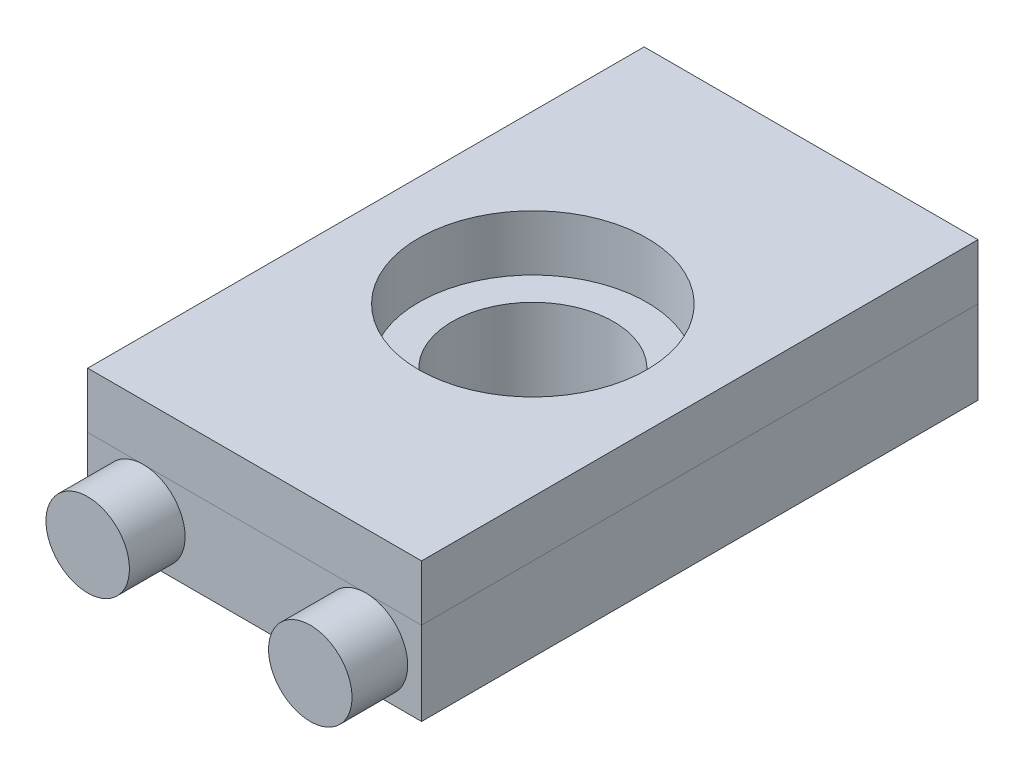
ISO-10303-21;
HEADER;
FILE_DESCRIPTION(('STEP AP214'),'2;1');
FILE_NAME('part.step','',(''),(''),'','','');
FILE_SCHEMA(('AUTOMOTIVE_DESIGN { 1 0 10303 214 1 1 1 1 }'));
ENDSEC;
DATA;
#1=APPLICATION_CONTEXT('core data for automotive mechanical design processes');
#2=APPLICATION_PROTOCOL_DEFINITION('international standard','automotive_design',2000,#1);
#3=PRODUCT_CONTEXT('',#1,'mechanical');
#4=PRODUCT('Part','Part','',(#3));
#5=PRODUCT_RELATED_PRODUCT_CATEGORY('part','',(#4));
#6=PRODUCT_DEFINITION_FORMATION('','',#4);
#7=PRODUCT_DEFINITION_CONTEXT('part definition',#1,'design');
#8=PRODUCT_DEFINITION('design','',#6,#7);
#9=PRODUCT_DEFINITION_SHAPE('','',#8);
#10=(LENGTH_UNIT() NAMED_UNIT(*) SI_UNIT(.MILLI.,.METRE.));
#11=(NAMED_UNIT(*) PLANE_ANGLE_UNIT() SI_UNIT($,.RADIAN.));
#12=(NAMED_UNIT(*) SI_UNIT($,.STERADIAN.) SOLID_ANGLE_UNIT());
#13=UNCERTAINTY_MEASURE_WITH_UNIT(LENGTH_MEASURE(1.E-05),#10,'distance_accuracy_value','');
#14=(GEOMETRIC_REPRESENTATION_CONTEXT(3) GLOBAL_UNCERTAINTY_ASSIGNED_CONTEXT((#13)) GLOBAL_UNIT_ASSIGNED_CONTEXT((#10,
#11,#12)) REPRESENTATION_CONTEXT('',''));
#15=CARTESIAN_POINT('',(0.,0.,0.));
#16=DIRECTION('',(0.,0.,1.));
#17=DIRECTION('',(1.,0.,0.));
#18=AXIS2_PLACEMENT_3D('',#15,#16,#17);
#19=CARTESIAN_POINT('',(12.,5.,0.));
#20=DIRECTION('',(-1.,0.,0.));
#21=DIRECTION('',(0.,0.,1.));
#22=AXIS2_PLACEMENT_3D('',#19,#20,#21);
#23=PLANE('',#22);
#24=DIRECTION('',(0.,0.,-1.));
#25=VECTOR('',#24,1.);
#26=CARTESIAN_POINT('',(12.,3.,0.));
#27=LINE('',#26,#25);
#28=CARTESIAN_POINT('',(12.,3.,0.));
#29=VERTEX_POINT('',#28);
#30=CARTESIAN_POINT('',(12.,3.,-20.));
#31=VERTEX_POINT('',#30);
#32=EDGE_CURVE('E139',#29,#31,#27,.T.);
#33=ORIENTED_EDGE('',*,*,#32,.T.);
#34=DIRECTION('',(0.,-1.,0.));
#35=VECTOR('',#34,1.);
#36=CARTESIAN_POINT('',(12.,5.,-20.));
#37=LINE('',#36,#35);
#38=CARTESIAN_POINT('',(12.,5.,-20.));
#39=VERTEX_POINT('',#38);
#40=EDGE_CURVE('E13',#39,#31,#37,.T.);
#41=ORIENTED_EDGE('',*,*,#40,.F.);
#42=DIRECTION('',(0.,0.,-1.));
#43=VECTOR('',#42,1.);
#44=CARTESIAN_POINT('',(12.,5.,0.));
#45=LINE('',#44,#43);
#46=CARTESIAN_POINT('',(12.,5.,0.));
#47=VERTEX_POINT('',#46);
#48=EDGE_CURVE('E124',#47,#39,#45,.T.);
#49=ORIENTED_EDGE('',*,*,#48,.F.);
#50=DIRECTION('',(0.,-1.,0.));
#51=VECTOR('',#50,1.);
#52=CARTESIAN_POINT('',(12.,5.,0.));
#53=LINE('',#52,#51);
#54=EDGE_CURVE('E132',#47,#29,#53,.T.);
#55=ORIENTED_EDGE('',*,*,#54,.T.);
#56=EDGE_LOOP('',(#33,#41,#49,#55));
#57=FACE_BOUND('',#56,.T.);
#58=ADVANCED_FACE('F72',(#57),#23,.F.);
#59=CARTESIAN_POINT('',(0.,5.,-20.));
#60=DIRECTION('',(0.,0.,1.));
#61=DIRECTION('',(1.,0.,0.));
#62=AXIS2_PLACEMENT_3D('',#59,#60,#61);
#63=PLANE('',#62);
#64=DIRECTION('',(-1.,0.,0.));
#65=VECTOR('',#64,1.);
#66=CARTESIAN_POINT('',(0.,3.,-20.));
#67=LINE('',#66,#65);
#68=CARTESIAN_POINT('',(0.,3.,-20.));
#69=VERTEX_POINT('',#68);
#70=EDGE_CURVE('E128',#31,#69,#67,.T.);
#71=ORIENTED_EDGE('',*,*,#70,.T.);
#72=DIRECTION('',(0.,-1.,0.));
#73=VECTOR('',#72,1.);
#74=CARTESIAN_POINT('',(0.,5.,-20.));
#75=LINE('',#74,#73);
#76=CARTESIAN_POINT('',(0.,5.,-20.));
#77=VERTEX_POINT('',#76);
#78=EDGE_CURVE('E81',#77,#69,#75,.T.);
#79=ORIENTED_EDGE('',*,*,#78,.F.);
#80=DIRECTION('',(-1.,0.,0.));
#81=VECTOR('',#80,1.);
#82=CARTESIAN_POINT('',(0.,5.,-20.));
#83=LINE('',#82,#81);
#84=EDGE_CURVE('E119',#39,#77,#83,.T.);
#85=ORIENTED_EDGE('',*,*,#84,.F.);
#86=ORIENTED_EDGE('',*,*,#40,.T.);
#87=EDGE_LOOP('',(#71,#79,#85,#86));
#88=FACE_BOUND('',#87,.T.);
#89=ADVANCED_FACE('F127',(#88),#63,.F.);
#90=CARTESIAN_POINT('',(0.,5.,0.));
#91=DIRECTION('',(1.,0.,0.));
#92=DIRECTION('',(0.,0.,-1.));
#93=AXIS2_PLACEMENT_3D('',#90,#91,#92);
#94=PLANE('',#93);
#95=DIRECTION('',(0.,0.,1.));
#96=VECTOR('',#95,1.);
#97=CARTESIAN_POINT('',(0.,3.,0.));
#98=LINE('',#97,#96);
#99=CARTESIAN_POINT('',(0.,3.,0.));
#100=VERTEX_POINT('',#99);
#101=EDGE_CURVE('E106',#69,#100,#98,.T.);
#102=ORIENTED_EDGE('',*,*,#101,.T.);
#103=DIRECTION('',(0.,-1.,0.));
#104=VECTOR('',#103,1.);
#105=CARTESIAN_POINT('',(0.,5.,0.));
#106=LINE('',#105,#104);
#107=CARTESIAN_POINT('',(0.,5.,0.));
#108=VERTEX_POINT('',#107);
#109=EDGE_CURVE('E129',#108,#100,#106,.T.);
#110=ORIENTED_EDGE('',*,*,#109,.F.);
#111=DIRECTION('',(0.,0.,1.));
#112=VECTOR('',#111,1.);
#113=CARTESIAN_POINT('',(0.,5.,0.));
#114=LINE('',#113,#112);
#115=EDGE_CURVE('E122',#77,#108,#114,.T.);
#116=ORIENTED_EDGE('',*,*,#115,.F.);
#117=ORIENTED_EDGE('',*,*,#78,.T.);
#118=EDGE_LOOP('',(#102,#110,#116,#117));
#119=FACE_BOUND('',#118,.T.);
#120=ADVANCED_FACE('F130',(#119),#94,.F.);
#121=CARTESIAN_POINT('',(6.,5.,-10.));
#122=DIRECTION('',(0.,-1.,0.));
#123=DIRECTION('',(0.,0.,-1.));
#124=AXIS2_PLACEMENT_3D('',#121,#122,#123);
#125=CYLINDRICAL_SURFACE('',#124,4.1);
#126=CARTESIAN_POINT('',(6.,5.,-10.));
#127=DIRECTION('',(0.,1.,0.));
#128=DIRECTION('',(0.,0.,1.));
#129=AXIS2_PLACEMENT_3D('',#126,#127,#128);
#130=CIRCLE('',#129,4.1);
#131=CARTESIAN_POINT('',(6.,5.,-5.9));
#132=VERTEX_POINT('',#131);
#133=EDGE_CURVE('E145',#132,#132,#130,.T.);
#134=ORIENTED_EDGE('',*,*,#133,.T.);
#135=EDGE_LOOP('',(#134));
#136=FACE_BOUND('',#135,.T.);
#137=CARTESIAN_POINT('',(6.,3.,-10.));
#138=DIRECTION('',(0.,1.,0.));
#139=DIRECTION('',(0.,0.,1.));
#140=AXIS2_PLACEMENT_3D('',#137,#138,#139);
#141=CIRCLE('',#140,4.1);
#142=CARTESIAN_POINT('',(6.,3.,-5.9));
#143=VERTEX_POINT('',#142);
#144=EDGE_CURVE('E136',#143,#143,#141,.T.);
#145=ORIENTED_EDGE('',*,*,#144,.F.);
#146=EDGE_LOOP('',(#145));
#147=FACE_BOUND('',#146,.T.);
#148=ADVANCED_FACE('F74',(#136,#147),#125,.F.);
#149=CARTESIAN_POINT('',(0.,5.,0.));
#150=DIRECTION('',(0.,0.,-1.));
#151=DIRECTION('',(-1.,0.,0.));
#152=AXIS2_PLACEMENT_3D('',#149,#150,#151);
#153=PLANE('',#152);
#154=DIRECTION('',(1.,0.,0.));
#155=VECTOR('',#154,1.);
#156=CARTESIAN_POINT('',(0.,3.,0.));
#157=LINE('',#156,#155);
#158=EDGE_CURVE('E112',#100,#29,#157,.T.);
#159=ORIENTED_EDGE('',*,*,#158,.T.);
#160=ORIENTED_EDGE('',*,*,#54,.F.);
#161=DIRECTION('',(1.,0.,0.));
#162=VECTOR('',#161,1.);
#163=CARTESIAN_POINT('',(0.,5.,0.));
#164=LINE('',#163,#162);
#165=EDGE_CURVE('E89',#108,#47,#164,.T.);
#166=ORIENTED_EDGE('',*,*,#165,.F.);
#167=ORIENTED_EDGE('',*,*,#109,.T.);
#168=EDGE_LOOP('',(#159,#160,#166,#167));
#169=FACE_BOUND('',#168,.T.);
#170=ADVANCED_FACE('F147',(#169),#153,.F.);
#171=CARTESIAN_POINT('',(0.,5.,0.));
#172=DIRECTION('',(0.,1.,0.));
#173=DIRECTION('',(0.,0.,1.));
#174=AXIS2_PLACEMENT_3D('',#171,#172,#173);
#175=PLANE('',#174);
#176=ORIENTED_EDGE('',*,*,#133,.F.);
#177=EDGE_LOOP('',(#176));
#178=FACE_BOUND('',#177,.T.);
#179=ORIENTED_EDGE('',*,*,#48,.T.);
#180=ORIENTED_EDGE('',*,*,#84,.T.);
#181=ORIENTED_EDGE('',*,*,#115,.T.);
#182=ORIENTED_EDGE('',*,*,#165,.T.);
#183=EDGE_LOOP('',(#179,#180,#181,#182));
#184=FACE_BOUND('',#183,.T.);
#185=ADVANCED_FACE('F120',(#178,#184),#175,.T.);
#186=CARTESIAN_POINT('',(0.,3.,0.));
#187=DIRECTION('',(0.,1.,0.));
#188=DIRECTION('',(0.,0.,1.));
#189=AXIS2_PLACEMENT_3D('',#186,#187,#188);
#190=PLANE('',#189);
#191=ORIENTED_EDGE('',*,*,#144,.T.);
#192=EDGE_LOOP('',(#191));
#193=FACE_BOUND('',#192,.T.);
#194=ORIENTED_EDGE('',*,*,#32,.F.);
#195=ORIENTED_EDGE('',*,*,#158,.F.);
#196=ORIENTED_EDGE('',*,*,#101,.F.);
#197=ORIENTED_EDGE('',*,*,#70,.F.);
#198=EDGE_LOOP('',(#194,#195,#196,#197));
#199=FACE_BOUND('',#198,.T.);
#200=ADVANCED_FACE('F150',(#193,#199),#190,.F.);
#201=CLOSED_SHELL('',(#58,#89,#120,#148,#170,#185,#200));
#202=MANIFOLD_SOLID_BREP('B2',#201);
#203=CARTESIAN_POINT('',(0.,3.,0.));
#204=DIRECTION('',(0.,0.,-1.));
#205=DIRECTION('',(-1.,0.,0.));
#206=AXIS2_PLACEMENT_3D('',#203,#204,#205);
#207=PLANE('',#206);
#208=CARTESIAN_POINT('',(2.,1.5,0.));
#209=DIRECTION('',(0.,0.,1.));
#210=DIRECTION('',(1.,0.,0.));
#211=AXIS2_PLACEMENT_3D('',#208,#209,#210);
#212=CIRCLE('',#211,1.5);
#213=CARTESIAN_POINT('',(2.,3.,0.));
#214=VERTEX_POINT('',#213);
#215=CARTESIAN_POINT('',(2.,0.,0.));
#216=VERTEX_POINT('',#215);
#217=EDGE_CURVE('E241',#214,#216,#212,.T.);
#218=ORIENTED_EDGE('',*,*,#217,.F.);
#219=DIRECTION('',(1.,0.,0.));
#220=VECTOR('',#219,1.);
#221=CARTESIAN_POINT('',(0.,3.,0.));
#222=LINE('',#221,#220);
#223=CARTESIAN_POINT('',(0.,3.,0.));
#224=VERTEX_POINT('',#223);
#225=EDGE_CURVE('E339',#224,#214,#222,.T.);
#226=ORIENTED_EDGE('',*,*,#225,.F.);
#227=DIRECTION('',(0.,-1.,0.));
#228=VECTOR('',#227,1.);
#229=CARTESIAN_POINT('',(0.,3.,0.));
#230=LINE('',#229,#228);
#231=CARTESIAN_POINT('',(0.,0.,0.));
#232=VERTEX_POINT('',#231);
#233=EDGE_CURVE('E314',#224,#232,#230,.T.);
#234=ORIENTED_EDGE('',*,*,#233,.T.);
#235=DIRECTION('',(1.,0.,0.));
#236=VECTOR('',#235,1.);
#237=CARTESIAN_POINT('',(0.,0.,0.));
#238=LINE('',#237,#236);
#239=EDGE_CURVE('E287',#232,#216,#238,.T.);
#240=ORIENTED_EDGE('',*,*,#239,.T.);
#241=EDGE_LOOP('',(#218,#226,#234,#240));
#242=FACE_BOUND('',#241,.T.);
#243=ADVANCED_FACE('F229',(#242),#207,.F.);
#244=CARTESIAN_POINT('',(10.,1.5,0.));
#245=DIRECTION('',(0.,0.,1.));
#246=DIRECTION('',(-1.,0.,0.));
#247=AXIS2_PLACEMENT_3D('',#244,#245,#246);
#248=CIRCLE('',#247,1.5);
#249=CARTESIAN_POINT('',(10.,0.,0.));
#250=VERTEX_POINT('',#249);
#251=CARTESIAN_POINT('',(10.,3.,0.));
#252=VERTEX_POINT('',#251);
#253=EDGE_CURVE('E302',#250,#252,#248,.T.);
#254=ORIENTED_EDGE('',*,*,#253,.F.);
#255=CARTESIAN_POINT('',(12.,0.,0.));
#256=VERTEX_POINT('',#255);
#257=EDGE_CURVE('E288',#250,#256,#238,.T.);
#258=ORIENTED_EDGE('',*,*,#257,.T.);
#259=DIRECTION('',(0.,-1.,0.));
#260=VECTOR('',#259,1.);
#261=CARTESIAN_POINT('',(12.,3.,0.));
#262=LINE('',#261,#260);
#263=CARTESIAN_POINT('',(12.,3.,0.));
#264=VERTEX_POINT('',#263);
#265=EDGE_CURVE('E356',#264,#256,#262,.T.);
#266=ORIENTED_EDGE('',*,*,#265,.F.);
#267=EDGE_CURVE('E304',#252,#264,#222,.T.);
#268=ORIENTED_EDGE('',*,*,#267,.F.);
#269=EDGE_LOOP('',(#254,#258,#266,#268));
#270=FACE_BOUND('',#269,.T.);
#271=ADVANCED_FACE('F303',(#270),#207,.F.);
#272=CARTESIAN_POINT('',(0.,3.,0.));
#273=DIRECTION('',(0.,1.,0.));
#274=DIRECTION('',(0.,0.,1.));
#275=AXIS2_PLACEMENT_3D('',#272,#273,#274);
#276=PLANE('',#275);
#277=DIRECTION('',(1.,0.,0.));
#278=VECTOR('',#277,1.);
#279=CARTESIAN_POINT('',(0.,3.,-20.));
#280=LINE('',#279,#278);
#281=CARTESIAN_POINT('',(0.,3.,-20.));
#282=VERTEX_POINT('',#281);
#283=CARTESIAN_POINT('',(12.,3.,-20.));
#284=VERTEX_POINT('',#283);
#285=EDGE_CURVE('E331',#282,#284,#280,.T.);
#286=ORIENTED_EDGE('',*,*,#285,.F.);
#287=DIRECTION('',(0.,0.,-1.));
#288=VECTOR('',#287,1.);
#289=CARTESIAN_POINT('',(0.,3.,0.));
#290=LINE('',#289,#288);
#291=EDGE_CURVE('E342',#224,#282,#290,.T.);
#292=ORIENTED_EDGE('',*,*,#291,.F.);
#293=ORIENTED_EDGE('',*,*,#225,.T.);
#294=EDGE_CURVE('E343',#214,#252,#222,.T.);
#295=ORIENTED_EDGE('',*,*,#294,.T.);
#296=ORIENTED_EDGE('',*,*,#267,.T.);
#297=DIRECTION('',(0.,0.,-1.));
#298=VECTOR('',#297,1.);
#299=CARTESIAN_POINT('',(12.,3.,0.));
#300=LINE('',#299,#298);
#301=EDGE_CURVE('E335',#264,#284,#300,.T.);
#302=ORIENTED_EDGE('',*,*,#301,.T.);
#303=EDGE_LOOP('',(#286,#292,#293,#295,#296,#302));
#304=FACE_BOUND('',#303,.T.);
#305=CARTESIAN_POINT('',(6.,3.,-10.));
#306=DIRECTION('',(0.,1.,0.));
#307=DIRECTION('',(0.,0.,1.));
#308=AXIS2_PLACEMENT_3D('',#305,#306,#307);
#309=CIRCLE('',#308,2.9);
#310=CARTESIAN_POINT('',(6.,3.,-7.1));
#311=VERTEX_POINT('',#310);
#312=EDGE_CURVE('E321',#311,#311,#309,.T.);
#313=ORIENTED_EDGE('',*,*,#312,.F.);
#314=EDGE_LOOP('',(#313));
#315=FACE_BOUND('',#314,.T.);
#316=ADVANCED_FACE('F372',(#304,#315),#276,.T.);
#317=CARTESIAN_POINT('',(0.,0.,0.));
#318=DIRECTION('',(0.,1.,0.));
#319=DIRECTION('',(0.,0.,1.));
#320=AXIS2_PLACEMENT_3D('',#317,#318,#319);
#321=PLANE('',#320);
#322=DIRECTION('',(1.,0.,0.));
#323=VECTOR('',#322,1.);
#324=CARTESIAN_POINT('',(0.,0.,-20.));
#325=LINE('',#324,#323);
#326=CARTESIAN_POINT('',(0.,0.,-20.));
#327=VERTEX_POINT('',#326);
#328=CARTESIAN_POINT('',(12.,0.,-20.));
#329=VERTEX_POINT('',#328);
#330=EDGE_CURVE('E325',#327,#329,#325,.T.);
#331=ORIENTED_EDGE('',*,*,#330,.T.);
#332=DIRECTION('',(0.,0.,-1.));
#333=VECTOR('',#332,1.);
#334=CARTESIAN_POINT('',(12.,0.,0.));
#335=LINE('',#334,#333);
#336=EDGE_CURVE('E296',#256,#329,#335,.T.);
#337=ORIENTED_EDGE('',*,*,#336,.F.);
#338=ORIENTED_EDGE('',*,*,#257,.F.);
#339=EDGE_CURVE('E280',#216,#250,#238,.T.);
#340=ORIENTED_EDGE('',*,*,#339,.F.);
#341=ORIENTED_EDGE('',*,*,#239,.F.);
#342=DIRECTION('',(0.,0.,-1.));
#343=VECTOR('',#342,1.);
#344=CARTESIAN_POINT('',(0.,0.,0.));
#345=LINE('',#344,#343);
#346=EDGE_CURVE('E336',#232,#327,#345,.T.);
#347=ORIENTED_EDGE('',*,*,#346,.T.);
#348=EDGE_LOOP('',(#331,#337,#338,#340,#341,#347));
#349=FACE_BOUND('',#348,.T.);
#350=CARTESIAN_POINT('',(6.,0.,-10.));
#351=DIRECTION('',(0.,1.,0.));
#352=DIRECTION('',(0.,0.,1.));
#353=AXIS2_PLACEMENT_3D('',#350,#351,#352);
#354=CIRCLE('',#353,2.9);
#355=CARTESIAN_POINT('',(6.,0.,-7.1));
#356=VERTEX_POINT('',#355);
#357=EDGE_CURVE('E326',#356,#356,#354,.T.);
#358=ORIENTED_EDGE('',*,*,#357,.T.);
#359=EDGE_LOOP('',(#358));
#360=FACE_BOUND('',#359,.T.);
#361=ADVANCED_FACE('F293',(#349,#360),#321,.F.);
#362=CARTESIAN_POINT('',(0.,3.,-20.));
#363=DIRECTION('',(0.,0.,-1.));
#364=DIRECTION('',(-1.,0.,0.));
#365=AXIS2_PLACEMENT_3D('',#362,#363,#364);
#366=PLANE('',#365);
#367=ORIENTED_EDGE('',*,*,#330,.F.);
#368=DIRECTION('',(0.,-1.,0.));
#369=VECTOR('',#368,1.);
#370=CARTESIAN_POINT('',(0.,3.,-20.));
#371=LINE('',#370,#369);
#372=EDGE_CURVE('E312',#282,#327,#371,.T.);
#373=ORIENTED_EDGE('',*,*,#372,.F.);
#374=ORIENTED_EDGE('',*,*,#285,.T.);
#375=DIRECTION('',(0.,-1.,0.));
#376=VECTOR('',#375,1.);
#377=CARTESIAN_POINT('',(12.,3.,-20.));
#378=LINE('',#377,#376);
#379=EDGE_CURVE('E233',#284,#329,#378,.T.);
#380=ORIENTED_EDGE('',*,*,#379,.T.);
#381=EDGE_LOOP('',(#367,#373,#374,#380));
#382=FACE_BOUND('',#381,.T.);
#383=ADVANCED_FACE('F231',(#382),#366,.T.);
#384=CARTESIAN_POINT('',(0.,3.,0.));
#385=DIRECTION('',(-1.,0.,0.));
#386=DIRECTION('',(0.,0.,1.));
#387=AXIS2_PLACEMENT_3D('',#384,#385,#386);
#388=PLANE('',#387);
#389=ORIENTED_EDGE('',*,*,#346,.F.);
#390=ORIENTED_EDGE('',*,*,#233,.F.);
#391=ORIENTED_EDGE('',*,*,#291,.T.);
#392=ORIENTED_EDGE('',*,*,#372,.T.);
#393=EDGE_LOOP('',(#389,#390,#391,#392));
#394=FACE_BOUND('',#393,.T.);
#395=ADVANCED_FACE('F368',(#394),#388,.T.);
#396=EDGE_CURVE('E70',#216,#214,#212,.T.);
#397=ORIENTED_EDGE('',*,*,#396,.F.);
#398=ORIENTED_EDGE('',*,*,#339,.T.);
#399=EDGE_CURVE('E239',#252,#250,#248,.T.);
#400=ORIENTED_EDGE('',*,*,#399,.F.);
#401=ORIENTED_EDGE('',*,*,#294,.F.);
#402=EDGE_LOOP('',(#397,#398,#400,#401));
#403=FACE_BOUND('',#402,.T.);
#404=ADVANCED_FACE('F282',(#403),#207,.F.);
#405=CARTESIAN_POINT('',(12.,3.,0.));
#406=DIRECTION('',(-1.,0.,0.));
#407=DIRECTION('',(0.,0.,1.));
#408=AXIS2_PLACEMENT_3D('',#405,#406,#407);
#409=PLANE('',#408);
#410=ORIENTED_EDGE('',*,*,#336,.T.);
#411=ORIENTED_EDGE('',*,*,#379,.F.);
#412=ORIENTED_EDGE('',*,*,#301,.F.);
#413=ORIENTED_EDGE('',*,*,#265,.T.);
#414=EDGE_LOOP('',(#410,#411,#412,#413));
#415=FACE_BOUND('',#414,.T.);
#416=ADVANCED_FACE('F365',(#415),#409,.F.);
#417=CARTESIAN_POINT('',(6.,3.,-10.));
#418=DIRECTION('',(0.,-1.,0.));
#419=DIRECTION('',(0.,0.,-1.));
#420=AXIS2_PLACEMENT_3D('',#417,#418,#419);
#421=CYLINDRICAL_SURFACE('',#420,2.9);
#422=ORIENTED_EDGE('',*,*,#312,.T.);
#423=EDGE_LOOP('',(#422));
#424=FACE_BOUND('',#423,.T.);
#425=ORIENTED_EDGE('',*,*,#357,.F.);
#426=EDGE_LOOP('',(#425));
#427=FACE_BOUND('',#426,.T.);
#428=ADVANCED_FACE('F397',(#424,#427),#421,.F.);
#429=CARTESIAN_POINT('',(10.,1.5,2.));
#430=DIRECTION('',(0.,0.,-1.));
#431=DIRECTION('',(-1.,0.,0.));
#432=AXIS2_PLACEMENT_3D('',#429,#430,#431);
#433=CYLINDRICAL_SURFACE('',#432,1.5);
#434=CARTESIAN_POINT('',(10.,1.5,2.));
#435=DIRECTION('',(0.,0.,1.));
#436=DIRECTION('',(-1.,0.,0.));
#437=AXIS2_PLACEMENT_3D('',#434,#435,#436);
#438=CIRCLE('',#437,1.5);
#439=CARTESIAN_POINT('',(8.5,1.5,2.));
#440=VERTEX_POINT('',#439);
#441=EDGE_CURVE('E308',#440,#440,#438,.T.);
#442=ORIENTED_EDGE('',*,*,#441,.F.);
#443=EDGE_LOOP('',(#442));
#444=FACE_BOUND('',#443,.T.);
#445=ORIENTED_EDGE('',*,*,#253,.T.);
#446=ORIENTED_EDGE('',*,*,#399,.T.);
#447=EDGE_LOOP('',(#445,#446));
#448=FACE_BOUND('',#447,.T.);
#449=ADVANCED_FACE('F310',(#444,#448),#433,.T.);
#450=CARTESIAN_POINT('',(10.,1.5,2.));
#451=DIRECTION('',(0.,0.,-1.));
#452=DIRECTION('',(-1.,0.,0.));
#453=AXIS2_PLACEMENT_3D('',#450,#451,#452);
#454=PLANE('',#453);
#455=ORIENTED_EDGE('',*,*,#441,.T.);
#456=EDGE_LOOP('',(#455));
#457=FACE_BOUND('',#456,.T.);
#458=ADVANCED_FACE('F408',(#457),#454,.F.);
#459=CARTESIAN_POINT('',(2.,1.5,2.));
#460=DIRECTION('',(0.,0.,-1.));
#461=DIRECTION('',(-1.,0.,0.));
#462=AXIS2_PLACEMENT_3D('',#459,#460,#461);
#463=CYLINDRICAL_SURFACE('',#462,1.5);
#464=CARTESIAN_POINT('',(2.,1.5,2.));
#465=DIRECTION('',(0.,0.,1.));
#466=DIRECTION('',(1.,0.,0.));
#467=AXIS2_PLACEMENT_3D('',#464,#465,#466);
#468=CIRCLE('',#467,1.5);
#469=CARTESIAN_POINT('',(3.5,1.5,2.));
#470=VERTEX_POINT('',#469);
#471=EDGE_CURVE('E330',#470,#470,#468,.T.);
#472=ORIENTED_EDGE('',*,*,#471,.F.);
#473=EDGE_LOOP('',(#472));
#474=FACE_BOUND('',#473,.T.);
#475=ORIENTED_EDGE('',*,*,#217,.T.);
#476=ORIENTED_EDGE('',*,*,#396,.T.);
#477=EDGE_LOOP('',(#475,#476));
#478=FACE_BOUND('',#477,.T.);
#479=ADVANCED_FACE('F382',(#474,#478),#463,.T.);
#480=CARTESIAN_POINT('',(2.,1.5,2.));
#481=DIRECTION('',(0.,0.,1.));
#482=DIRECTION('',(1.,0.,0.));
#483=AXIS2_PLACEMENT_3D('',#480,#481,#482);
#484=PLANE('',#483);
#485=ORIENTED_EDGE('',*,*,#471,.T.);
#486=EDGE_LOOP('',(#485));
#487=FACE_BOUND('',#486,.T.);
#488=ADVANCED_FACE('F416',(#487),#484,.T.);
#489=CLOSED_SHELL('',(#243,#271,#316,#361,#383,#395,#404,#416,#428,#449,#458,#479,#488));
#490=MANIFOLD_SOLID_BREP('B7',#489);
#491=ADVANCED_BREP_SHAPE_REPRESENTATION('',(#18,#202,#490),#14);
#492=SHAPE_DEFINITION_REPRESENTATION(#9,#491);
ENDSEC;
END-ISO-10303-21;
